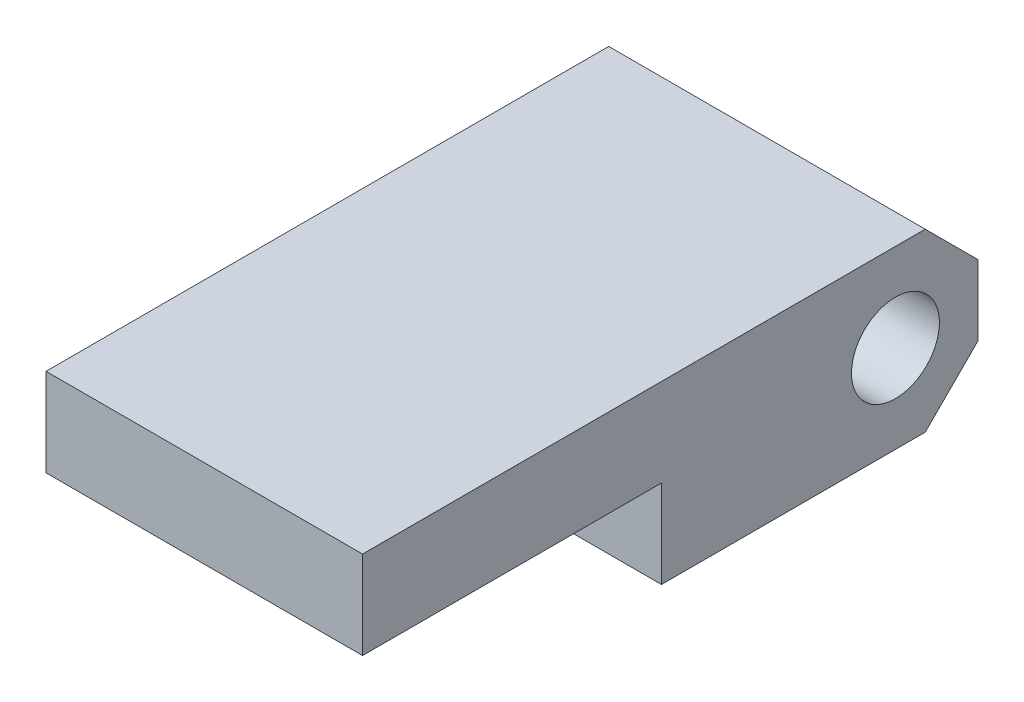
ISO-10303-21;
HEADER;
FILE_DESCRIPTION(('STEP AP214'),'2;1');
FILE_NAME('part.step','',(''),(''),'','','');
FILE_SCHEMA(('AUTOMOTIVE_DESIGN { 1 0 10303 214 1 1 1 1 }'));
ENDSEC;
DATA;
#1=APPLICATION_CONTEXT('core data for automotive mechanical design processes');
#2=APPLICATION_PROTOCOL_DEFINITION('international standard','automotive_design',2000,#1);
#3=PRODUCT_CONTEXT('',#1,'mechanical');
#4=PRODUCT('Part','Part','',(#3));
#5=PRODUCT_RELATED_PRODUCT_CATEGORY('part','',(#4));
#6=PRODUCT_DEFINITION_FORMATION('','',#4);
#7=PRODUCT_DEFINITION_CONTEXT('part definition',#1,'design');
#8=PRODUCT_DEFINITION('design','',#6,#7);
#9=PRODUCT_DEFINITION_SHAPE('','',#8);
#10=(LENGTH_UNIT() NAMED_UNIT(*) SI_UNIT(.MILLI.,.METRE.));
#11=(NAMED_UNIT(*) PLANE_ANGLE_UNIT() SI_UNIT($,.RADIAN.));
#12=(NAMED_UNIT(*) SI_UNIT($,.STERADIAN.) SOLID_ANGLE_UNIT());
#13=UNCERTAINTY_MEASURE_WITH_UNIT(LENGTH_MEASURE(1.E-05),#10,'distance_accuracy_value','');
#14=(GEOMETRIC_REPRESENTATION_CONTEXT(3) GLOBAL_UNCERTAINTY_ASSIGNED_CONTEXT((#13)) GLOBAL_UNIT_ASSIGNED_CONTEXT((#10,
#11,#12)) REPRESENTATION_CONTEXT('',''));
#15=CARTESIAN_POINT('',(0.,0.,0.));
#16=DIRECTION('',(0.,0.,1.));
#17=DIRECTION('',(1.,0.,0.));
#18=AXIS2_PLACEMENT_3D('',#15,#16,#17);
#19=CARTESIAN_POINT('',(0.,10.,0.));
#20=DIRECTION('',(1.,0.,0.));
#21=DIRECTION('',(0.,0.,-1.));
#22=AXIS2_PLACEMENT_3D('',#19,#20,#21);
#23=PLANE('',#22);
#24=CARTESIAN_POINT('',(0.,5.,4.69555975115926));
#25=DIRECTION('',(-1.,0.,0.));
#26=DIRECTION('',(0.,0.,1.));
#27=AXIS2_PLACEMENT_3D('',#24,#25,#26);
#28=CIRCLE('',#27,2.5);
#29=CARTESIAN_POINT('',(0.,5.,7.19555975115926));
#30=VERTEX_POINT('',#29);
#31=EDGE_CURVE('E174',#30,#30,#28,.T.);
#32=ORIENTED_EDGE('',*,*,#31,.F.);
#33=EDGE_LOOP('',(#32));
#34=FACE_BOUND('',#33,.T.);
#35=DIRECTION('',(0.,-1.,0.));
#36=VECTOR('',#35,1.);
#37=CARTESIAN_POINT('',(0.,10.,0.));
#38=LINE('',#37,#36);
#39=CARTESIAN_POINT('',(0.,6.99999999999999,0.));
#40=VERTEX_POINT('',#39);
#41=CARTESIAN_POINT('',(0.,3.,0.));
#42=VERTEX_POINT('',#41);
#43=EDGE_CURVE('E152',#40,#42,#38,.T.);
#44=ORIENTED_EDGE('',*,*,#43,.T.);
#45=DIRECTION('',(0.,0.707106781186546,-0.707106781186549));
#46=VECTOR('',#45,1.);
#47=CARTESIAN_POINT('',(0.,3.,0.));
#48=LINE('',#47,#46);
#49=CARTESIAN_POINT('',(0.,0.,3.00000000000002));
#50=VERTEX_POINT('',#49);
#51=EDGE_CURVE('E138',#42,#50,#48,.F.);
#52=ORIENTED_EDGE('',*,*,#51,.T.);
#53=DIRECTION('',(0.,0.,1.));
#54=VECTOR('',#53,1.);
#55=CARTESIAN_POINT('',(0.,0.,0.));
#56=LINE('',#55,#54);
#57=CARTESIAN_POINT('',(0.,0.,18.));
#58=VERTEX_POINT('',#57);
#59=EDGE_CURVE('E109',#50,#58,#56,.T.);
#60=ORIENTED_EDGE('',*,*,#59,.T.);
#61=DIRECTION('',(0.,-1.,0.));
#62=VECTOR('',#61,1.);
#63=CARTESIAN_POINT('',(0.,5.,18.));
#64=LINE('',#63,#62);
#65=CARTESIAN_POINT('',(0.,5.,18.));
#66=VERTEX_POINT('',#65);
#67=EDGE_CURVE('E119',#66,#58,#64,.T.);
#68=ORIENTED_EDGE('',*,*,#67,.F.);
#69=DIRECTION('',(0.,0.,-1.));
#70=VECTOR('',#69,1.);
#71=CARTESIAN_POINT('',(0.,5.,35.));
#72=LINE('',#71,#70);
#73=CARTESIAN_POINT('',(0.,5.,35.));
#74=VERTEX_POINT('',#73);
#75=EDGE_CURVE('E101',#74,#66,#72,.T.);
#76=ORIENTED_EDGE('',*,*,#75,.F.);
#77=DIRECTION('',(0.,-1.,0.));
#78=VECTOR('',#77,1.);
#79=CARTESIAN_POINT('',(0.,10.,35.));
#80=LINE('',#79,#78);
#81=CARTESIAN_POINT('',(0.,10.,35.));
#82=VERTEX_POINT('',#81);
#83=EDGE_CURVE('E117',#82,#74,#80,.T.);
#84=ORIENTED_EDGE('',*,*,#83,.F.);
#85=DIRECTION('',(0.,0.,1.));
#86=VECTOR('',#85,1.);
#87=CARTESIAN_POINT('',(0.,10.,0.));
#88=LINE('',#87,#86);
#89=CARTESIAN_POINT('',(0.,10.,3.));
#90=VERTEX_POINT('',#89);
#91=EDGE_CURVE('E158',#90,#82,#88,.T.);
#92=ORIENTED_EDGE('',*,*,#91,.F.);
#93=DIRECTION('',(0.,-0.707106781186549,-0.707106781186546));
#94=VECTOR('',#93,1.);
#95=CARTESIAN_POINT('',(0.,10.,3.));
#96=LINE('',#95,#94);
#97=EDGE_CURVE('E136',#90,#40,#96,.T.);
#98=ORIENTED_EDGE('',*,*,#97,.T.);
#99=EDGE_LOOP('',(#44,#52,#60,#68,#76,#84,#92,#98));
#100=FACE_BOUND('',#99,.T.);
#101=ADVANCED_FACE('F30',(#34,#100),#23,.F.);
#102=CARTESIAN_POINT('',(0.,10.,35.));
#103=DIRECTION('',(0.,0.,-1.));
#104=DIRECTION('',(-1.,0.,0.));
#105=AXIS2_PLACEMENT_3D('',#102,#103,#104);
#106=PLANE('',#105);
#107=DIRECTION('',(1.,0.,0.));
#108=VECTOR('',#107,1.);
#109=CARTESIAN_POINT('',(0.,5.,35.));
#110=LINE('',#109,#108);
#111=CARTESIAN_POINT('',(18.,5.,35.));
#112=VERTEX_POINT('',#111);
#113=EDGE_CURVE('E98',#74,#112,#110,.T.);
#114=ORIENTED_EDGE('',*,*,#113,.T.);
#115=DIRECTION('',(0.,-1.,0.));
#116=VECTOR('',#115,1.);
#117=CARTESIAN_POINT('',(18.,10.,35.));
#118=LINE('',#117,#116);
#119=CARTESIAN_POINT('',(18.,10.,35.));
#120=VERTEX_POINT('',#119);
#121=EDGE_CURVE('E126',#120,#112,#118,.T.);
#122=ORIENTED_EDGE('',*,*,#121,.F.);
#123=DIRECTION('',(1.,0.,0.));
#124=VECTOR('',#123,1.);
#125=CARTESIAN_POINT('',(0.,10.,35.));
#126=LINE('',#125,#124);
#127=EDGE_CURVE('E124',#82,#120,#126,.T.);
#128=ORIENTED_EDGE('',*,*,#127,.F.);
#129=ORIENTED_EDGE('',*,*,#83,.T.);
#130=EDGE_LOOP('',(#114,#122,#128,#129));
#131=FACE_BOUND('',#130,.T.);
#132=ADVANCED_FACE('F123',(#131),#106,.F.);
#133=CARTESIAN_POINT('',(18.,10.,0.));
#134=DIRECTION('',(-1.,0.,0.));
#135=DIRECTION('',(0.,0.,1.));
#136=AXIS2_PLACEMENT_3D('',#133,#134,#135);
#137=PLANE('',#136);
#138=CARTESIAN_POINT('',(18.,5.,4.69555975115926));
#139=DIRECTION('',(-1.,0.,0.));
#140=DIRECTION('',(0.,0.,1.));
#141=AXIS2_PLACEMENT_3D('',#138,#139,#140);
#142=CIRCLE('',#141,2.5);
#143=CARTESIAN_POINT('',(18.,5.,7.19555975115926));
#144=VERTEX_POINT('',#143);
#145=EDGE_CURVE('E172',#144,#144,#142,.T.);
#146=ORIENTED_EDGE('',*,*,#145,.T.);
#147=EDGE_LOOP('',(#146));
#148=FACE_BOUND('',#147,.T.);
#149=DIRECTION('',(0.,0.,-1.));
#150=VECTOR('',#149,1.);
#151=CARTESIAN_POINT('',(18.,0.,0.));
#152=LINE('',#151,#150);
#153=CARTESIAN_POINT('',(18.,0.,18.));
#154=VERTEX_POINT('',#153);
#155=CARTESIAN_POINT('',(18.,0.,3.00000000000002));
#156=VERTEX_POINT('',#155);
#157=EDGE_CURVE('E145',#154,#156,#152,.T.);
#158=ORIENTED_EDGE('',*,*,#157,.T.);
#159=DIRECTION('',(0.,-0.707106781186546,0.707106781186549));
#160=VECTOR('',#159,1.);
#161=CARTESIAN_POINT('',(18.,3.,0.));
#162=LINE('',#161,#160);
#163=CARTESIAN_POINT('',(18.,3.,0.));
#164=VERTEX_POINT('',#163);
#165=EDGE_CURVE('E38',#156,#164,#162,.F.);
#166=ORIENTED_EDGE('',*,*,#165,.T.);
#167=DIRECTION('',(0.,-1.,0.));
#168=VECTOR('',#167,1.);
#169=CARTESIAN_POINT('',(18.,10.,0.));
#170=LINE('',#169,#168);
#171=CARTESIAN_POINT('',(18.,6.99999999999999,0.));
#172=VERTEX_POINT('',#171);
#173=EDGE_CURVE('E130',#172,#164,#170,.T.);
#174=ORIENTED_EDGE('',*,*,#173,.F.);
#175=DIRECTION('',(0.,0.707106781186549,0.707106781186546));
#176=VECTOR('',#175,1.);
#177=CARTESIAN_POINT('',(18.,10.,3.));
#178=LINE('',#177,#176);
#179=CARTESIAN_POINT('',(18.,10.,3.));
#180=VERTEX_POINT('',#179);
#181=EDGE_CURVE('E45',#172,#180,#178,.T.);
#182=ORIENTED_EDGE('',*,*,#181,.T.);
#183=DIRECTION('',(0.,0.,-1.));
#184=VECTOR('',#183,1.);
#185=CARTESIAN_POINT('',(18.,10.,0.));
#186=LINE('',#185,#184);
#187=EDGE_CURVE('E161',#120,#180,#186,.T.);
#188=ORIENTED_EDGE('',*,*,#187,.F.);
#189=ORIENTED_EDGE('',*,*,#121,.T.);
#190=DIRECTION('',(0.,0.,-1.));
#191=VECTOR('',#190,1.);
#192=CARTESIAN_POINT('',(18.,5.,35.));
#193=LINE('',#192,#191);
#194=CARTESIAN_POINT('',(18.,5.,18.));
#195=VERTEX_POINT('',#194);
#196=EDGE_CURVE('E104',#112,#195,#193,.T.);
#197=ORIENTED_EDGE('',*,*,#196,.T.);
#198=DIRECTION('',(0.,-1.,0.));
#199=VECTOR('',#198,1.);
#200=CARTESIAN_POINT('',(18.,5.,18.));
#201=LINE('',#200,#199);
#202=EDGE_CURVE('E120',#195,#154,#201,.T.);
#203=ORIENTED_EDGE('',*,*,#202,.T.);
#204=EDGE_LOOP('',(#158,#166,#174,#182,#188,#189,#197,#203));
#205=FACE_BOUND('',#204,.T.);
#206=ADVANCED_FACE('F143',(#148,#205),#137,.F.);
#207=CARTESIAN_POINT('',(0.,0.,35.));
#208=DIRECTION('',(0.,1.,0.));
#209=DIRECTION('',(0.,0.,1.));
#210=AXIS2_PLACEMENT_3D('',#207,#208,#209);
#211=PLANE('',#210);
#212=ORIENTED_EDGE('',*,*,#59,.F.);
#213=DIRECTION('',(1.,0.,0.));
#214=VECTOR('',#213,1.);
#215=CARTESIAN_POINT('',(0.,0.,3.00000000000002));
#216=LINE('',#215,#214);
#217=EDGE_CURVE('E53',#50,#156,#216,.T.);
#218=ORIENTED_EDGE('',*,*,#217,.T.);
#219=ORIENTED_EDGE('',*,*,#157,.F.);
#220=DIRECTION('',(1.,0.,0.));
#221=VECTOR('',#220,1.);
#222=CARTESIAN_POINT('',(0.,0.,18.));
#223=LINE('',#222,#221);
#224=EDGE_CURVE('E156',#58,#154,#223,.T.);
#225=ORIENTED_EDGE('',*,*,#224,.F.);
#226=EDGE_LOOP('',(#212,#218,#219,#225));
#227=FACE_BOUND('',#226,.T.);
#228=ADVANCED_FACE('F155',(#227),#211,.F.);
#229=CARTESIAN_POINT('',(0.,10.,0.));
#230=DIRECTION('',(0.,0.,1.));
#231=DIRECTION('',(1.,0.,0.));
#232=AXIS2_PLACEMENT_3D('',#229,#230,#231);
#233=PLANE('',#232);
#234=ORIENTED_EDGE('',*,*,#173,.T.);
#235=DIRECTION('',(-1.,0.,0.));
#236=VECTOR('',#235,1.);
#237=CARTESIAN_POINT('',(0.,3.,0.));
#238=LINE('',#237,#236);
#239=EDGE_CURVE('E128',#164,#42,#238,.T.);
#240=ORIENTED_EDGE('',*,*,#239,.T.);
#241=ORIENTED_EDGE('',*,*,#43,.F.);
#242=DIRECTION('',(1.,0.,0.));
#243=VECTOR('',#242,1.);
#244=CARTESIAN_POINT('',(18.,6.99999999999999,0.));
#245=LINE('',#244,#243);
#246=EDGE_CURVE('E125',#40,#172,#245,.T.);
#247=ORIENTED_EDGE('',*,*,#246,.T.);
#248=EDGE_LOOP('',(#234,#240,#241,#247));
#249=FACE_BOUND('',#248,.T.);
#250=ADVANCED_FACE('F149',(#249),#233,.F.);
#251=CARTESIAN_POINT('',(0.,10.,35.));
#252=DIRECTION('',(0.,1.,0.));
#253=DIRECTION('',(0.,0.,1.));
#254=AXIS2_PLACEMENT_3D('',#251,#252,#253);
#255=PLANE('',#254);
#256=ORIENTED_EDGE('',*,*,#187,.T.);
#257=DIRECTION('',(-1.,0.,0.));
#258=VECTOR('',#257,1.);
#259=CARTESIAN_POINT('',(0.,10.,3.));
#260=LINE('',#259,#258);
#261=EDGE_CURVE('E11',#180,#90,#260,.T.);
#262=ORIENTED_EDGE('',*,*,#261,.T.);
#263=ORIENTED_EDGE('',*,*,#91,.T.);
#264=ORIENTED_EDGE('',*,*,#127,.T.);
#265=EDGE_LOOP('',(#256,#262,#263,#264));
#266=FACE_BOUND('',#265,.T.);
#267=ADVANCED_FACE('F202',(#266),#255,.T.);
#268=CARTESIAN_POINT('',(0.,5.,35.));
#269=DIRECTION('',(0.,-1.,0.));
#270=DIRECTION('',(0.,0.,-1.));
#271=AXIS2_PLACEMENT_3D('',#268,#269,#270);
#272=PLANE('',#271);
#273=ORIENTED_EDGE('',*,*,#196,.F.);
#274=ORIENTED_EDGE('',*,*,#113,.F.);
#275=ORIENTED_EDGE('',*,*,#75,.T.);
#276=DIRECTION('',(1.,0.,0.));
#277=VECTOR('',#276,1.);
#278=CARTESIAN_POINT('',(0.,5.,18.));
#279=LINE('',#278,#277);
#280=EDGE_CURVE('E110',#66,#195,#279,.T.);
#281=ORIENTED_EDGE('',*,*,#280,.T.);
#282=EDGE_LOOP('',(#273,#274,#275,#281));
#283=FACE_BOUND('',#282,.T.);
#284=ADVANCED_FACE('F100',(#283),#272,.T.);
#285=CARTESIAN_POINT('',(0.,5.,18.));
#286=DIRECTION('',(0.,0.,1.));
#287=DIRECTION('',(1.,0.,0.));
#288=AXIS2_PLACEMENT_3D('',#285,#286,#287);
#289=PLANE('',#288);
#290=ORIENTED_EDGE('',*,*,#202,.F.);
#291=ORIENTED_EDGE('',*,*,#280,.F.);
#292=ORIENTED_EDGE('',*,*,#67,.T.);
#293=ORIENTED_EDGE('',*,*,#224,.T.);
#294=EDGE_LOOP('',(#290,#291,#292,#293));
#295=FACE_BOUND('',#294,.T.);
#296=ADVANCED_FACE('F184',(#295),#289,.T.);
#297=CARTESIAN_POINT('',(18.,5.,4.69555975115926));
#298=DIRECTION('',(-1.,0.,0.));
#299=DIRECTION('',(0.,0.,1.));
#300=AXIS2_PLACEMENT_3D('',#297,#298,#299);
#301=CYLINDRICAL_SURFACE('',#300,2.5);
#302=ORIENTED_EDGE('',*,*,#145,.F.);
#303=EDGE_LOOP('',(#302));
#304=FACE_BOUND('',#303,.T.);
#305=ORIENTED_EDGE('',*,*,#31,.T.);
#306=EDGE_LOOP('',(#305));
#307=FACE_BOUND('',#306,.T.);
#308=ADVANCED_FACE('F181',(#304,#307),#301,.F.);
#309=CARTESIAN_POINT('',(0.,3.,0.));
#310=DIRECTION('',(0.,0.707106781186549,0.707106781186546));
#311=DIRECTION('',(0.,-0.707106781186546,0.707106781186549));
#312=AXIS2_PLACEMENT_3D('',#309,#310,#311);
#313=PLANE('',#312);
#314=ORIENTED_EDGE('',*,*,#165,.F.);
#315=ORIENTED_EDGE('',*,*,#217,.F.);
#316=ORIENTED_EDGE('',*,*,#51,.F.);
#317=ORIENTED_EDGE('',*,*,#239,.F.);
#318=EDGE_LOOP('',(#314,#315,#316,#317));
#319=FACE_BOUND('',#318,.T.);
#320=ADVANCED_FACE('F153',(#319),#313,.F.);
#321=CARTESIAN_POINT('',(0.,10.,3.));
#322=DIRECTION('',(0.,0.707106781186546,-0.707106781186549));
#323=DIRECTION('',(0.,0.707106781186549,0.707106781186546));
#324=AXIS2_PLACEMENT_3D('',#321,#322,#323);
#325=PLANE('',#324);
#326=ORIENTED_EDGE('',*,*,#181,.F.);
#327=ORIENTED_EDGE('',*,*,#246,.F.);
#328=ORIENTED_EDGE('',*,*,#97,.F.);
#329=ORIENTED_EDGE('',*,*,#261,.F.);
#330=EDGE_LOOP('',(#326,#327,#328,#329));
#331=FACE_BOUND('',#330,.T.);
#332=ADVANCED_FACE('F32',(#331),#325,.T.);
#333=CLOSED_SHELL('',(#101,#132,#206,#228,#250,#267,#284,#296,#308,#320,#332));
#334=MANIFOLD_SOLID_BREP('B2',#333);
#335=ADVANCED_BREP_SHAPE_REPRESENTATION('',(#18,#334),#14);
#336=SHAPE_DEFINITION_REPRESENTATION(#9,#335);
ENDSEC;
END-ISO-10303-21;
